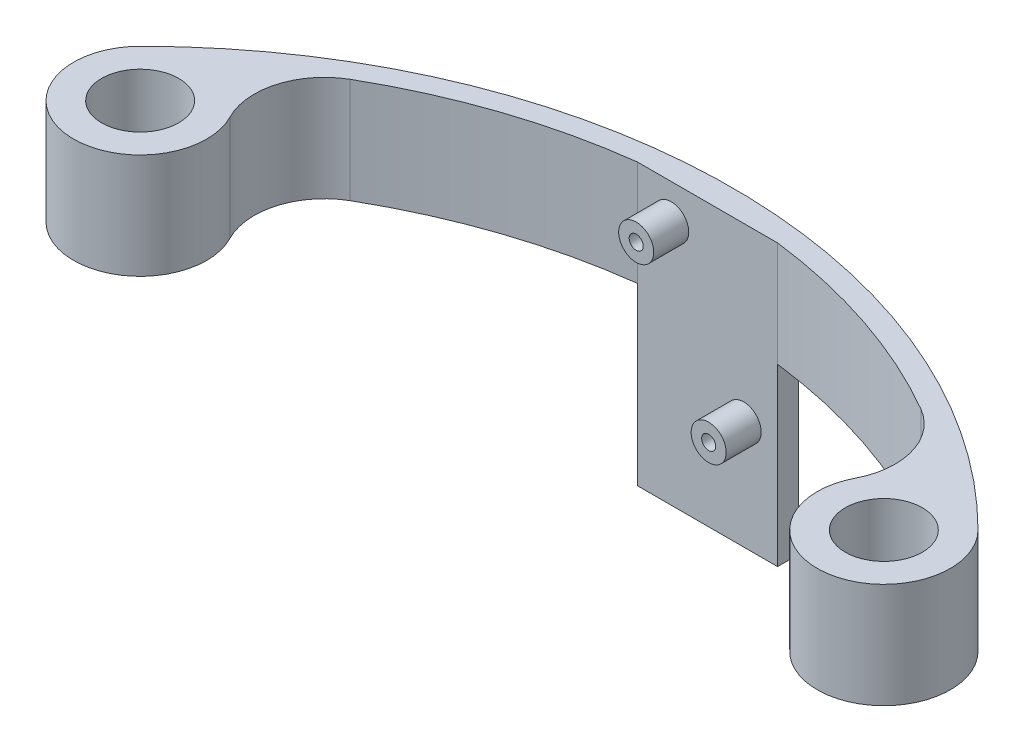
ISO-10303-21;
HEADER;
FILE_DESCRIPTION(('STEP AP214'),'2;1');
FILE_NAME('part.step','',(''),(''),'','','');
FILE_SCHEMA(('AUTOMOTIVE_DESIGN { 1 0 10303 214 1 1 1 1 }'));
ENDSEC;
DATA;
#1=APPLICATION_CONTEXT('core data for automotive mechanical design processes');
#2=APPLICATION_PROTOCOL_DEFINITION('international standard','automotive_design',2000,#1);
#3=PRODUCT_CONTEXT('',#1,'mechanical');
#4=PRODUCT('Part','Part','',(#3));
#5=PRODUCT_RELATED_PRODUCT_CATEGORY('part','',(#4));
#6=PRODUCT_DEFINITION_FORMATION('','',#4);
#7=PRODUCT_DEFINITION_CONTEXT('part definition',#1,'design');
#8=PRODUCT_DEFINITION('design','',#6,#7);
#9=PRODUCT_DEFINITION_SHAPE('','',#8);
#10=(LENGTH_UNIT() NAMED_UNIT(*) SI_UNIT(.MILLI.,.METRE.));
#11=(NAMED_UNIT(*) PLANE_ANGLE_UNIT() SI_UNIT($,.RADIAN.));
#12=(NAMED_UNIT(*) SI_UNIT($,.STERADIAN.) SOLID_ANGLE_UNIT());
#13=UNCERTAINTY_MEASURE_WITH_UNIT(LENGTH_MEASURE(1.E-05),#10,'distance_accuracy_value','');
#14=(GEOMETRIC_REPRESENTATION_CONTEXT(3) GLOBAL_UNCERTAINTY_ASSIGNED_CONTEXT((#13)) GLOBAL_UNIT_ASSIGNED_CONTEXT((#10,
#11,#12)) REPRESENTATION_CONTEXT('',''));
#15=CARTESIAN_POINT('',(0.,0.,0.));
#16=DIRECTION('',(0.,0.,1.));
#17=DIRECTION('',(1.,0.,0.));
#18=AXIS2_PLACEMENT_3D('',#15,#16,#17);
#19=CARTESIAN_POINT('',(0.,0.,0.));
#20=DIRECTION('',(0.,0.,1.));
#21=DIRECTION('',(1.,0.,0.));
#22=AXIS2_PLACEMENT_3D('',#19,#20,#21);
#23=PLANE('',#22);
#24=DIRECTION('',(-1.,0.,0.));
#25=VECTOR('',#24,1.);
#26=CARTESIAN_POINT('',(0.,-15.,0.));
#27=LINE('',#26,#25);
#28=CARTESIAN_POINT('',(20.,-15.,0.));
#29=VERTEX_POINT('',#28);
#30=CARTESIAN_POINT('',(0.,-15.,0.));
#31=VERTEX_POINT('',#30);
#32=EDGE_CURVE('E168',#29,#31,#27,.T.);
#33=ORIENTED_EDGE('',*,*,#32,.F.);
#34=DIRECTION('',(0.,-1.,0.));
#35=VECTOR('',#34,1.);
#36=CARTESIAN_POINT('',(20.,0.,0.));
#37=LINE('',#36,#35);
#38=CARTESIAN_POINT('',(20.,-40.,0.));
#39=VERTEX_POINT('',#38);
#40=EDGE_CURVE('E156',#29,#39,#37,.T.);
#41=ORIENTED_EDGE('',*,*,#40,.T.);
#42=DIRECTION('',(1.,0.,0.));
#43=VECTOR('',#42,1.);
#44=CARTESIAN_POINT('',(0.,-40.,0.));
#45=LINE('',#44,#43);
#46=CARTESIAN_POINT('',(0.,-40.,0.));
#47=VERTEX_POINT('',#46);
#48=EDGE_CURVE('E301',#47,#39,#45,.T.);
#49=ORIENTED_EDGE('',*,*,#48,.F.);
#50=DIRECTION('',(0.,-1.,0.));
#51=VECTOR('',#50,1.);
#52=CARTESIAN_POINT('',(0.,0.,0.));
#53=LINE('',#52,#51);
#54=EDGE_CURVE('E164',#31,#47,#53,.T.);
#55=ORIENTED_EDGE('',*,*,#54,.F.);
#56=EDGE_LOOP('',(#33,#41,#49,#55));
#57=FACE_BOUND('',#56,.T.);
#58=ADVANCED_FACE('F47',(#57),#23,.F.);
#59=CARTESIAN_POINT('',(0.,0.,3.));
#60=DIRECTION('',(1.,0.,0.));
#61=DIRECTION('',(0.,1.,0.));
#62=AXIS2_PLACEMENT_3D('',#59,#60,#61);
#63=PLANE('',#62);
#64=DIRECTION('',(0.,0.,1.));
#65=VECTOR('',#64,1.);
#66=CARTESIAN_POINT('',(0.,-15.,0.));
#67=LINE('',#66,#65);
#68=CARTESIAN_POINT('',(0.,-15.,3.));
#69=VERTEX_POINT('',#68);
#70=EDGE_CURVE('E71',#31,#69,#67,.T.);
#71=ORIENTED_EDGE('',*,*,#70,.F.);
#72=ORIENTED_EDGE('',*,*,#54,.T.);
#73=DIRECTION('',(0.,0.,-1.));
#74=VECTOR('',#73,1.);
#75=CARTESIAN_POINT('',(0.,-40.,3.));
#76=LINE('',#75,#74);
#77=CARTESIAN_POINT('',(0.,-40.,3.));
#78=VERTEX_POINT('',#77);
#79=EDGE_CURVE('E306',#78,#47,#76,.T.);
#80=ORIENTED_EDGE('',*,*,#79,.F.);
#81=DIRECTION('',(0.,-1.,0.));
#82=VECTOR('',#81,1.);
#83=CARTESIAN_POINT('',(0.,0.,3.));
#84=LINE('',#83,#82);
#85=EDGE_CURVE('E291',#69,#78,#84,.T.);
#86=ORIENTED_EDGE('',*,*,#85,.F.);
#87=EDGE_LOOP('',(#71,#72,#80,#86));
#88=FACE_BOUND('',#87,.T.);
#89=ADVANCED_FACE('F342',(#88),#63,.F.);
#90=CARTESIAN_POINT('',(20.,0.,3.));
#91=DIRECTION('',(1.,0.,0.));
#92=DIRECTION('',(0.,1.,0.));
#93=AXIS2_PLACEMENT_3D('',#90,#91,#92);
#94=PLANE('',#93);
#95=DIRECTION('',(0.,0.,-1.));
#96=VECTOR('',#95,1.);
#97=CARTESIAN_POINT('',(20.,-15.,0.));
#98=LINE('',#97,#96);
#99=CARTESIAN_POINT('',(20.,-15.,3.));
#100=VERTEX_POINT('',#99);
#101=EDGE_CURVE('E63',#100,#29,#98,.T.);
#102=ORIENTED_EDGE('',*,*,#101,.F.);
#103=DIRECTION('',(0.,-1.,0.));
#104=VECTOR('',#103,1.);
#105=CARTESIAN_POINT('',(20.,0.,3.));
#106=LINE('',#105,#104);
#107=CARTESIAN_POINT('',(20.,-40.,3.));
#108=VERTEX_POINT('',#107);
#109=EDGE_CURVE('E287',#100,#108,#106,.T.);
#110=ORIENTED_EDGE('',*,*,#109,.T.);
#111=DIRECTION('',(0.,0.,-1.));
#112=VECTOR('',#111,1.);
#113=CARTESIAN_POINT('',(20.,-40.,3.));
#114=LINE('',#113,#112);
#115=EDGE_CURVE('E159',#108,#39,#114,.T.);
#116=ORIENTED_EDGE('',*,*,#115,.T.);
#117=ORIENTED_EDGE('',*,*,#40,.F.);
#118=EDGE_LOOP('',(#102,#110,#116,#117));
#119=FACE_BOUND('',#118,.T.);
#120=ADVANCED_FACE('F49',(#119),#94,.T.);
#121=CARTESIAN_POINT('',(0.,0.,3.));
#122=DIRECTION('',(0.,1.,0.));
#123=DIRECTION('',(0.,0.,1.));
#124=AXIS2_PLACEMENT_3D('',#121,#122,#123);
#125=PLANE('',#124);
#126=CARTESIAN_POINT('',(63.05,0.,30.8901858933761));
#127=DIRECTION('',(0.,1.,0.));
#128=DIRECTION('',(0.,0.,1.));
#129=AXIS2_PLACEMENT_3D('',#126,#127,#128);
#130=CIRCLE('',#129,9.50000000000001);
#131=CARTESIAN_POINT('',(54.6086294125521,0.,26.5320598505258));
#132=VERTEX_POINT('',#131);
#133=CARTESIAN_POINT('',(69.7696666666667,0.,24.174824407284));
#134=VERTEX_POINT('',#133);
#135=EDGE_CURVE('E182',#132,#134,#130,.T.);
#136=ORIENTED_EDGE('',*,*,#135,.T.);
#137=CARTESIAN_POINT('',(10.,0.,83.906197625682));
#138=DIRECTION('',(0.,1.,0.));
#139=DIRECTION('',(0.,0.,1.));
#140=AXIS2_PLACEMENT_3D('',#137,#138,#139);
#141=CIRCLE('',#140,84.5);
#142=CARTESIAN_POINT('',(-49.7696666666667,0.,24.1748244072839));
#143=VERTEX_POINT('',#142);
#144=EDGE_CURVE('E240',#134,#143,#141,.T.);
#145=ORIENTED_EDGE('',*,*,#144,.T.);
#146=CARTESIAN_POINT('',(-43.05,0.,30.8901858933761));
#147=DIRECTION('',(0.,1.,0.));
#148=DIRECTION('',(0.,0.,1.));
#149=AXIS2_PLACEMENT_3D('',#146,#147,#148);
#150=CIRCLE('',#149,9.50000000000004);
#151=CARTESIAN_POINT('',(-34.6086294125521,0.,26.5320598505257));
#152=VERTEX_POINT('',#151);
#153=EDGE_CURVE('E244',#143,#152,#150,.T.);
#154=ORIENTED_EDGE('',*,*,#153,.T.);
#155=CARTESIAN_POINT('',(-25.722976162607,0.,21.9445587527886));
#156=DIRECTION('',(0.,1.,0.));
#157=DIRECTION('',(0.,0.,1.));
#158=AXIS2_PLACEMENT_3D('',#155,#156,#157);
#159=CIRCLE('',#158,10.);
#160=CARTESIAN_POINT('',(-30.7176699173471,0.,13.2812433195171));
#161=VERTEX_POINT('',#160);
#162=EDGE_CURVE('E207',#161,#152,#159,.T.);
#163=ORIENTED_EDGE('',*,*,#162,.F.);
#164=CARTESIAN_POINT('',(10.,0.,83.906197625682));
#165=DIRECTION('',(0.,1.,0.));
#166=DIRECTION('',(0.,0.,1.));
#167=AXIS2_PLACEMENT_3D('',#164,#165,#166);
#168=CIRCLE('',#167,81.5218548258436);
#169=CARTESIAN_POINT('',(0.,0.,3.));
#170=VERTEX_POINT('',#169);
#171=EDGE_CURVE('E237',#170,#161,#168,.T.);
#172=ORIENTED_EDGE('',*,*,#171,.F.);
#173=DIRECTION('',(1.,0.,0.));
#174=VECTOR('',#173,1.);
#175=CARTESIAN_POINT('',(0.,0.,3.));
#176=LINE('',#175,#174);
#177=CARTESIAN_POINT('',(20.,0.,3.));
#178=VERTEX_POINT('',#177);
#179=EDGE_CURVE('E286',#170,#178,#176,.T.);
#180=ORIENTED_EDGE('',*,*,#179,.T.);
#181=CARTESIAN_POINT('',(10.,0.,83.906197625682));
#182=DIRECTION('',(0.,1.,0.));
#183=DIRECTION('',(0.,0.,1.));
#184=AXIS2_PLACEMENT_3D('',#181,#182,#183);
#185=CIRCLE('',#184,81.5218548258436);
#186=CARTESIAN_POINT('',(50.7176699173472,0.,13.2812433195171));
#187=VERTEX_POINT('',#186);
#188=EDGE_CURVE('E194',#187,#178,#185,.T.);
#189=ORIENTED_EDGE('',*,*,#188,.F.);
#190=CARTESIAN_POINT('',(45.722976162607,0.,21.9445587527886));
#191=DIRECTION('',(0.,1.,0.));
#192=DIRECTION('',(0.,0.,1.));
#193=AXIS2_PLACEMENT_3D('',#190,#191,#192);
#194=CIRCLE('',#193,10.);
#195=EDGE_CURVE('E198',#187,#132,#194,.F.);
#196=ORIENTED_EDGE('',*,*,#195,.T.);
#197=EDGE_LOOP('',(#136,#145,#154,#163,#172,#180,#189,#196));
#198=FACE_BOUND('',#197,.T.);
#199=CARTESIAN_POINT('',(-43.05,0.,30.8901858933761));
#200=DIRECTION('',(0.,1.,0.));
#201=DIRECTION('',(0.,0.,1.));
#202=AXIS2_PLACEMENT_3D('',#199,#200,#201);
#203=CIRCLE('',#202,5.5);
#204=CARTESIAN_POINT('',(-43.05,0.,36.3901858933761));
#205=VERTEX_POINT('',#204);
#206=EDGE_CURVE('E217',#205,#205,#203,.T.);
#207=ORIENTED_EDGE('',*,*,#206,.F.);
#208=EDGE_LOOP('',(#207));
#209=FACE_BOUND('',#208,.T.);
#210=CARTESIAN_POINT('',(63.05,0.,30.8901858933761));
#211=DIRECTION('',(0.,1.,0.));
#212=DIRECTION('',(0.,0.,1.));
#213=AXIS2_PLACEMENT_3D('',#210,#211,#212);
#214=CIRCLE('',#213,5.5);
#215=CARTESIAN_POINT('',(63.05,0.,36.3901858933761));
#216=VERTEX_POINT('',#215);
#217=EDGE_CURVE('E172',#216,#216,#214,.T.);
#218=ORIENTED_EDGE('',*,*,#217,.F.);
#219=EDGE_LOOP('',(#218));
#220=FACE_BOUND('',#219,.T.);
#221=ADVANCED_FACE('F349',(#198,#209,#220),#125,.T.);
#222=CARTESIAN_POINT('',(0.,-40.,3.));
#223=DIRECTION('',(0.,1.,0.));
#224=DIRECTION('',(0.,0.,1.));
#225=AXIS2_PLACEMENT_3D('',#222,#223,#224);
#226=PLANE('',#225);
#227=ORIENTED_EDGE('',*,*,#48,.T.);
#228=ORIENTED_EDGE('',*,*,#115,.F.);
#229=DIRECTION('',(1.,0.,0.));
#230=VECTOR('',#229,1.);
#231=CARTESIAN_POINT('',(0.,-40.,3.));
#232=LINE('',#231,#230);
#233=EDGE_CURVE('E295',#78,#108,#232,.T.);
#234=ORIENTED_EDGE('',*,*,#233,.F.);
#235=ORIENTED_EDGE('',*,*,#79,.T.);
#236=EDGE_LOOP('',(#227,#228,#234,#235));
#237=FACE_BOUND('',#236,.T.);
#238=ADVANCED_FACE('F335',(#237),#226,.F.);
#239=CARTESIAN_POINT('',(0.,0.,3.));
#240=DIRECTION('',(0.,0.,1.));
#241=DIRECTION('',(1.,0.,0.));
#242=AXIS2_PLACEMENT_3D('',#239,#240,#241);
#243=PLANE('',#242);
#244=CARTESIAN_POINT('',(15.1678,-24.558,3.));
#245=DIRECTION('',(0.,0.,1.));
#246=DIRECTION('',(1.,0.,0.));
#247=AXIS2_PLACEMENT_3D('',#244,#245,#246);
#248=CIRCLE('',#247,2.5);
#249=CARTESIAN_POINT('',(17.6678,-24.558,3.));
#250=VERTEX_POINT('',#249);
#251=EDGE_CURVE('E254',#250,#250,#248,.T.);
#252=ORIENTED_EDGE('',*,*,#251,.F.);
#253=EDGE_LOOP('',(#252));
#254=FACE_BOUND('',#253,.T.);
#255=CARTESIAN_POINT('',(4.83,-5.,3.));
#256=DIRECTION('',(0.,0.,1.));
#257=DIRECTION('',(1.,0.,0.));
#258=AXIS2_PLACEMENT_3D('',#255,#256,#257);
#259=CIRCLE('',#258,2.5);
#260=CARTESIAN_POINT('',(7.33,-5.,3.));
#261=VERTEX_POINT('',#260);
#262=EDGE_CURVE('E269',#261,#261,#259,.T.);
#263=ORIENTED_EDGE('',*,*,#262,.F.);
#264=EDGE_LOOP('',(#263));
#265=FACE_BOUND('',#264,.T.);
#266=EDGE_CURVE('E283',#178,#100,#106,.T.);
#267=ORIENTED_EDGE('',*,*,#266,.F.);
#268=ORIENTED_EDGE('',*,*,#179,.F.);
#269=EDGE_CURVE('E292',#170,#69,#84,.T.);
#270=ORIENTED_EDGE('',*,*,#269,.T.);
#271=ORIENTED_EDGE('',*,*,#85,.T.);
#272=ORIENTED_EDGE('',*,*,#233,.T.);
#273=ORIENTED_EDGE('',*,*,#109,.F.);
#274=EDGE_LOOP('',(#267,#268,#270,#271,#272,#273));
#275=FACE_BOUND('',#274,.T.);
#276=ADVANCED_FACE('F320',(#254,#265,#275),#243,.T.);
#277=CARTESIAN_POINT('',(4.83,-5.,8.));
#278=DIRECTION('',(0.,0.,-1.));
#279=DIRECTION('',(-1.,0.,0.));
#280=AXIS2_PLACEMENT_3D('',#277,#278,#279);
#281=CYLINDRICAL_SURFACE('',#280,1.);
#282=CARTESIAN_POINT('',(4.83,-5.,8.));
#283=DIRECTION('',(0.,0.,1.));
#284=DIRECTION('',(1.,0.,0.));
#285=AXIS2_PLACEMENT_3D('',#282,#283,#284);
#286=CIRCLE('',#285,1.);
#287=CARTESIAN_POINT('',(5.83,-5.,8.));
#288=VERTEX_POINT('',#287);
#289=EDGE_CURVE('E273',#288,#288,#286,.T.);
#290=ORIENTED_EDGE('',*,*,#289,.T.);
#291=EDGE_LOOP('',(#290));
#292=FACE_BOUND('',#291,.T.);
#293=CARTESIAN_POINT('',(4.83,-5.,3.));
#294=DIRECTION('',(0.,0.,1.));
#295=DIRECTION('',(1.,0.,0.));
#296=AXIS2_PLACEMENT_3D('',#293,#294,#295);
#297=CIRCLE('',#296,1.);
#298=CARTESIAN_POINT('',(5.83,-5.,3.));
#299=VERTEX_POINT('',#298);
#300=EDGE_CURVE('E56',#299,#299,#297,.F.);
#301=ORIENTED_EDGE('',*,*,#300,.T.);
#302=EDGE_LOOP('',(#301));
#303=FACE_BOUND('',#302,.T.);
#304=ADVANCED_FACE('F313',(#292,#303),#281,.F.);
#305=CARTESIAN_POINT('',(4.83,-5.,8.));
#306=DIRECTION('',(0.,0.,-1.));
#307=DIRECTION('',(-1.,0.,0.));
#308=AXIS2_PLACEMENT_3D('',#305,#306,#307);
#309=CYLINDRICAL_SURFACE('',#308,2.5);
#310=CARTESIAN_POINT('',(4.83,-5.,8.));
#311=DIRECTION('',(0.,0.,1.));
#312=DIRECTION('',(1.,0.,0.));
#313=AXIS2_PLACEMENT_3D('',#310,#311,#312);
#314=CIRCLE('',#313,2.5);
#315=CARTESIAN_POINT('',(7.33,-5.,8.));
#316=VERTEX_POINT('',#315);
#317=EDGE_CURVE('E165',#316,#316,#314,.T.);
#318=ORIENTED_EDGE('',*,*,#317,.F.);
#319=EDGE_LOOP('',(#318));
#320=FACE_BOUND('',#319,.T.);
#321=ORIENTED_EDGE('',*,*,#262,.T.);
#322=EDGE_LOOP('',(#321));
#323=FACE_BOUND('',#322,.T.);
#324=ADVANCED_FACE('F329',(#320,#323),#309,.T.);
#325=CARTESIAN_POINT('',(0.,0.,8.));
#326=DIRECTION('',(0.,0.,1.));
#327=DIRECTION('',(1.,0.,0.));
#328=AXIS2_PLACEMENT_3D('',#325,#326,#327);
#329=PLANE('',#328);
#330=ORIENTED_EDGE('',*,*,#289,.F.);
#331=EDGE_LOOP('',(#330));
#332=FACE_BOUND('',#331,.T.);
#333=ORIENTED_EDGE('',*,*,#317,.T.);
#334=EDGE_LOOP('',(#333));
#335=FACE_BOUND('',#334,.T.);
#336=ADVANCED_FACE('F318',(#332,#335),#329,.T.);
#337=ORIENTED_EDGE('',*,*,#300,.F.);
#338=EDGE_LOOP('',(#337));
#339=FACE_BOUND('',#338,.T.);
#340=ADVANCED_FACE('F315',(#339),#243,.T.);
#341=CARTESIAN_POINT('',(15.1678,-24.558,8.));
#342=DIRECTION('',(0.,0.,-1.));
#343=DIRECTION('',(-1.,0.,0.));
#344=AXIS2_PLACEMENT_3D('',#341,#342,#343);
#345=CYLINDRICAL_SURFACE('',#344,1.);
#346=CARTESIAN_POINT('',(15.1678,-24.558,8.));
#347=DIRECTION('',(0.,0.,1.));
#348=DIRECTION('',(1.,0.,0.));
#349=AXIS2_PLACEMENT_3D('',#346,#347,#348);
#350=CIRCLE('',#349,1.);
#351=CARTESIAN_POINT('',(16.1678,-24.558,8.));
#352=VERTEX_POINT('',#351);
#353=EDGE_CURVE('E261',#352,#352,#350,.T.);
#354=ORIENTED_EDGE('',*,*,#353,.T.);
#355=EDGE_LOOP('',(#354));
#356=FACE_BOUND('',#355,.T.);
#357=CARTESIAN_POINT('',(15.1678,-24.558,3.));
#358=DIRECTION('',(0.,0.,1.));
#359=DIRECTION('',(1.,0.,0.));
#360=AXIS2_PLACEMENT_3D('',#357,#358,#359);
#361=CIRCLE('',#360,1.);
#362=CARTESIAN_POINT('',(16.1678,-24.558,3.));
#363=VERTEX_POINT('',#362);
#364=EDGE_CURVE('E11',#363,#363,#361,.F.);
#365=ORIENTED_EDGE('',*,*,#364,.T.);
#366=EDGE_LOOP('',(#365));
#367=FACE_BOUND('',#366,.T.);
#368=ADVANCED_FACE('F317',(#356,#367),#345,.F.);
#369=CARTESIAN_POINT('',(15.1678,-24.558,8.));
#370=DIRECTION('',(0.,0.,-1.));
#371=DIRECTION('',(-1.,0.,0.));
#372=AXIS2_PLACEMENT_3D('',#369,#370,#371);
#373=CYLINDRICAL_SURFACE('',#372,2.5);
#374=CARTESIAN_POINT('',(15.1678,-24.558,8.));
#375=DIRECTION('',(0.,0.,1.));
#376=DIRECTION('',(1.,0.,0.));
#377=AXIS2_PLACEMENT_3D('',#374,#375,#376);
#378=CIRCLE('',#377,2.5);
#379=CARTESIAN_POINT('',(17.6678,-24.558,8.));
#380=VERTEX_POINT('',#379);
#381=EDGE_CURVE('E265',#380,#380,#378,.T.);
#382=ORIENTED_EDGE('',*,*,#381,.F.);
#383=EDGE_LOOP('',(#382));
#384=FACE_BOUND('',#383,.T.);
#385=ORIENTED_EDGE('',*,*,#251,.T.);
#386=EDGE_LOOP('',(#385));
#387=FACE_BOUND('',#386,.T.);
#388=ADVANCED_FACE('F326',(#384,#387),#373,.T.);
#389=CARTESIAN_POINT('',(0.,0.,8.));
#390=DIRECTION('',(0.,0.,1.));
#391=DIRECTION('',(1.,0.,0.));
#392=AXIS2_PLACEMENT_3D('',#389,#390,#391);
#393=PLANE('',#392);
#394=ORIENTED_EDGE('',*,*,#353,.F.);
#395=EDGE_LOOP('',(#394));
#396=FACE_BOUND('',#395,.T.);
#397=ORIENTED_EDGE('',*,*,#381,.T.);
#398=EDGE_LOOP('',(#397));
#399=FACE_BOUND('',#398,.T.);
#400=ADVANCED_FACE('F339',(#396,#399),#393,.T.);
#401=ORIENTED_EDGE('',*,*,#364,.F.);
#402=EDGE_LOOP('',(#401));
#403=FACE_BOUND('',#402,.T.);
#404=ADVANCED_FACE('F321',(#403),#243,.T.);
#405=CARTESIAN_POINT('',(-25.722976162607,-15.,21.9445587527886));
#406=DIRECTION('',(0.,1.,0.));
#407=DIRECTION('',(0.,0.,1.));
#408=AXIS2_PLACEMENT_3D('',#405,#406,#407);
#409=CYLINDRICAL_SURFACE('',#408,10.);
#410=ORIENTED_EDGE('',*,*,#162,.T.);
#411=DIRECTION('',(0.,1.,0.));
#412=VECTOR('',#411,1.);
#413=CARTESIAN_POINT('',(-34.6086294125521,-15.,26.5320598505257));
#414=LINE('',#413,#412);
#415=CARTESIAN_POINT('',(-34.6086294125521,-15.,26.5320598505257));
#416=VERTEX_POINT('',#415);
#417=EDGE_CURVE('E251',#416,#152,#414,.T.);
#418=ORIENTED_EDGE('',*,*,#417,.F.);
#419=CARTESIAN_POINT('',(-25.722976162607,-15.,21.9445587527886));
#420=DIRECTION('',(0.,1.,0.));
#421=DIRECTION('',(0.,0.,1.));
#422=AXIS2_PLACEMENT_3D('',#419,#420,#421);
#423=CIRCLE('',#422,10.);
#424=CARTESIAN_POINT('',(-30.7176699173471,-15.,13.2812433195171));
#425=VERTEX_POINT('',#424);
#426=EDGE_CURVE('E213',#425,#416,#423,.T.);
#427=ORIENTED_EDGE('',*,*,#426,.F.);
#428=DIRECTION('',(0.,1.,0.));
#429=VECTOR('',#428,1.);
#430=CARTESIAN_POINT('',(-30.7176699173471,-15.,13.2812433195171));
#431=LINE('',#430,#429);
#432=EDGE_CURVE('E233',#425,#161,#431,.T.);
#433=ORIENTED_EDGE('',*,*,#432,.T.);
#434=EDGE_LOOP('',(#410,#418,#427,#433));
#435=FACE_BOUND('',#434,.T.);
#436=ADVANCED_FACE('F338',(#435),#409,.F.);
#437=CARTESIAN_POINT('',(-43.05,-15.,30.8901858933761));
#438=DIRECTION('',(0.,1.,0.));
#439=DIRECTION('',(0.,0.,1.));
#440=AXIS2_PLACEMENT_3D('',#437,#438,#439);
#441=CYLINDRICAL_SURFACE('',#440,9.50000000000004);
#442=ORIENTED_EDGE('',*,*,#153,.F.);
#443=DIRECTION('',(0.,1.,0.));
#444=VECTOR('',#443,1.);
#445=CARTESIAN_POINT('',(-49.7696666666667,-15.,24.1748244072839));
#446=LINE('',#445,#444);
#447=CARTESIAN_POINT('',(-49.7696666666667,-15.,24.1748244072839));
#448=VERTEX_POINT('',#447);
#449=EDGE_CURVE('E255',#448,#143,#446,.T.);
#450=ORIENTED_EDGE('',*,*,#449,.F.);
#451=CARTESIAN_POINT('',(-43.05,-15.,30.8901858933761));
#452=DIRECTION('',(0.,1.,0.));
#453=DIRECTION('',(0.,0.,1.));
#454=AXIS2_PLACEMENT_3D('',#451,#452,#453);
#455=CIRCLE('',#454,9.50000000000004);
#456=EDGE_CURVE('E225',#448,#416,#455,.T.);
#457=ORIENTED_EDGE('',*,*,#456,.T.);
#458=ORIENTED_EDGE('',*,*,#417,.T.);
#459=EDGE_LOOP('',(#442,#450,#457,#458));
#460=FACE_BOUND('',#459,.T.);
#461=ADVANCED_FACE('F389',(#460),#441,.T.);
#462=CARTESIAN_POINT('',(10.,-15.,83.906197625682));
#463=DIRECTION('',(0.,1.,0.));
#464=DIRECTION('',(0.,0.,1.));
#465=AXIS2_PLACEMENT_3D('',#462,#463,#464);
#466=CYLINDRICAL_SURFACE('',#465,84.5);
#467=ORIENTED_EDGE('',*,*,#144,.F.);
#468=DIRECTION('',(0.,1.,0.));
#469=VECTOR('',#468,1.);
#470=CARTESIAN_POINT('',(69.7696666666667,-15.,24.174824407284));
#471=LINE('',#470,#469);
#472=CARTESIAN_POINT('',(69.7696666666667,-15.,24.174824407284));
#473=VERTEX_POINT('',#472);
#474=EDGE_CURVE('E139',#473,#134,#471,.T.);
#475=ORIENTED_EDGE('',*,*,#474,.F.);
#476=CARTESIAN_POINT('',(10.,-15.,83.906197625682));
#477=DIRECTION('',(0.,1.,0.));
#478=DIRECTION('',(0.,0.,1.));
#479=AXIS2_PLACEMENT_3D('',#476,#477,#478);
#480=CIRCLE('',#479,84.5);
#481=EDGE_CURVE('E133',#473,#29,#480,.T.);
#482=ORIENTED_EDGE('',*,*,#481,.T.);
#483=CARTESIAN_POINT('',(10.,-15.,83.906197625682));
#484=DIRECTION('',(0.,1.,0.));
#485=DIRECTION('',(0.,0.,1.));
#486=AXIS2_PLACEMENT_3D('',#483,#484,#485);
#487=CIRCLE('',#486,84.5);
#488=EDGE_CURVE('E137',#29,#31,#487,.T.);
#489=ORIENTED_EDGE('',*,*,#488,.T.);
#490=CARTESIAN_POINT('',(10.,-15.,83.906197625682));
#491=DIRECTION('',(0.,1.,0.));
#492=DIRECTION('',(0.,0.,1.));
#493=AXIS2_PLACEMENT_3D('',#490,#491,#492);
#494=CIRCLE('',#493,84.5);
#495=EDGE_CURVE('E222',#31,#448,#494,.T.);
#496=ORIENTED_EDGE('',*,*,#495,.T.);
#497=ORIENTED_EDGE('',*,*,#449,.T.);
#498=EDGE_LOOP('',(#467,#475,#482,#489,#496,#497));
#499=FACE_BOUND('',#498,.T.);
#500=ADVANCED_FACE('F134',(#499),#466,.T.);
#501=CARTESIAN_POINT('',(10.,-15.,83.906197625682));
#502=DIRECTION('',(0.,1.,0.));
#503=DIRECTION('',(0.,0.,1.));
#504=AXIS2_PLACEMENT_3D('',#501,#502,#503);
#505=CYLINDRICAL_SURFACE('',#504,81.5218548258436);
#506=ORIENTED_EDGE('',*,*,#171,.T.);
#507=ORIENTED_EDGE('',*,*,#432,.F.);
#508=CARTESIAN_POINT('',(10.,-15.,83.906197625682));
#509=DIRECTION('',(0.,1.,0.));
#510=DIRECTION('',(0.,0.,1.));
#511=AXIS2_PLACEMENT_3D('',#508,#509,#510);
#512=CIRCLE('',#511,81.5218548258436);
#513=EDGE_CURVE('E216',#69,#425,#512,.T.);
#514=ORIENTED_EDGE('',*,*,#513,.F.);
#515=ORIENTED_EDGE('',*,*,#269,.F.);
#516=EDGE_LOOP('',(#506,#507,#514,#515));
#517=FACE_BOUND('',#516,.T.);
#518=ADVANCED_FACE('F387',(#517),#505,.F.);
#519=CARTESIAN_POINT('',(-43.05,-15.,30.8901858933761));
#520=DIRECTION('',(0.,1.,0.));
#521=DIRECTION('',(0.,0.,1.));
#522=AXIS2_PLACEMENT_3D('',#519,#520,#521);
#523=CYLINDRICAL_SURFACE('',#522,5.5);
#524=CARTESIAN_POINT('',(-43.05,-15.,30.8901858933761));
#525=DIRECTION('',(0.,1.,0.));
#526=DIRECTION('',(0.,0.,1.));
#527=AXIS2_PLACEMENT_3D('',#524,#525,#526);
#528=CIRCLE('',#527,5.5);
#529=CARTESIAN_POINT('',(-43.05,-15.,36.3901858933761));
#530=VERTEX_POINT('',#529);
#531=EDGE_CURVE('E229',#530,#530,#528,.T.);
#532=ORIENTED_EDGE('',*,*,#531,.F.);
#533=EDGE_LOOP('',(#532));
#534=FACE_BOUND('',#533,.T.);
#535=ORIENTED_EDGE('',*,*,#206,.T.);
#536=EDGE_LOOP('',(#535));
#537=FACE_BOUND('',#536,.T.);
#538=ADVANCED_FACE('F383',(#534,#537),#523,.F.);
#539=CARTESIAN_POINT('',(0.,-15.,0.));
#540=DIRECTION('',(0.,1.,0.));
#541=DIRECTION('',(0.,0.,1.));
#542=AXIS2_PLACEMENT_3D('',#539,#540,#541);
#543=PLANE('',#542);
#544=ORIENTED_EDGE('',*,*,#426,.T.);
#545=ORIENTED_EDGE('',*,*,#456,.F.);
#546=ORIENTED_EDGE('',*,*,#495,.F.);
#547=ORIENTED_EDGE('',*,*,#70,.T.);
#548=ORIENTED_EDGE('',*,*,#513,.T.);
#549=EDGE_LOOP('',(#544,#545,#546,#547,#548));
#550=FACE_BOUND('',#549,.T.);
#551=ORIENTED_EDGE('',*,*,#531,.T.);
#552=EDGE_LOOP('',(#551));
#553=FACE_BOUND('',#552,.T.);
#554=ADVANCED_FACE('F380',(#550,#553),#543,.F.);
#555=CARTESIAN_POINT('',(10.,-15.,83.906197625682));
#556=DIRECTION('',(0.,1.,0.));
#557=DIRECTION('',(0.,0.,1.));
#558=AXIS2_PLACEMENT_3D('',#555,#556,#557);
#559=CYLINDRICAL_SURFACE('',#558,81.5218548258436);
#560=ORIENTED_EDGE('',*,*,#188,.T.);
#561=ORIENTED_EDGE('',*,*,#266,.T.);
#562=CARTESIAN_POINT('',(10.,-15.,83.906197625682));
#563=DIRECTION('',(0.,1.,0.));
#564=DIRECTION('',(0.,0.,1.));
#565=AXIS2_PLACEMENT_3D('',#562,#563,#564);
#566=CIRCLE('',#565,81.5218548258436);
#567=CARTESIAN_POINT('',(50.7176699173472,-15.,13.2812433195171));
#568=VERTEX_POINT('',#567);
#569=EDGE_CURVE('E150',#568,#100,#566,.T.);
#570=ORIENTED_EDGE('',*,*,#569,.F.);
#571=DIRECTION('',(0.,1.,0.));
#572=VECTOR('',#571,1.);
#573=CARTESIAN_POINT('',(50.7176699173472,-15.,13.2812433195171));
#574=LINE('',#573,#572);
#575=EDGE_CURVE('E153',#568,#187,#574,.T.);
#576=ORIENTED_EDGE('',*,*,#575,.T.);
#577=EDGE_LOOP('',(#560,#561,#570,#576));
#578=FACE_BOUND('',#577,.T.);
#579=ADVANCED_FACE('F374',(#578),#559,.F.);
#580=CARTESIAN_POINT('',(63.05,-15.,30.8901858933761));
#581=DIRECTION('',(0.,1.,0.));
#582=DIRECTION('',(0.,0.,1.));
#583=AXIS2_PLACEMENT_3D('',#580,#581,#582);
#584=CYLINDRICAL_SURFACE('',#583,9.50000000000001);
#585=ORIENTED_EDGE('',*,*,#135,.F.);
#586=DIRECTION('',(0.,1.,0.));
#587=VECTOR('',#586,1.);
#588=CARTESIAN_POINT('',(54.6086294125521,-15.,26.5320598505258));
#589=LINE('',#588,#587);
#590=CARTESIAN_POINT('',(54.6086294125521,-15.,26.5320598505258));
#591=VERTEX_POINT('',#590);
#592=EDGE_CURVE('E208',#591,#132,#589,.T.);
#593=ORIENTED_EDGE('',*,*,#592,.F.);
#594=CARTESIAN_POINT('',(63.05,-15.,30.8901858933761));
#595=DIRECTION('',(0.,1.,0.));
#596=DIRECTION('',(0.,0.,1.));
#597=AXIS2_PLACEMENT_3D('',#594,#595,#596);
#598=CIRCLE('',#597,9.50000000000001);
#599=EDGE_CURVE('E144',#591,#473,#598,.T.);
#600=ORIENTED_EDGE('',*,*,#599,.T.);
#601=ORIENTED_EDGE('',*,*,#474,.T.);
#602=EDGE_LOOP('',(#585,#593,#600,#601));
#603=FACE_BOUND('',#602,.T.);
#604=ADVANCED_FACE('F365',(#603),#584,.T.);
#605=CARTESIAN_POINT('',(63.05,-15.,30.8901858933761));
#606=DIRECTION('',(0.,1.,0.));
#607=DIRECTION('',(0.,0.,1.));
#608=AXIS2_PLACEMENT_3D('',#605,#606,#607);
#609=CYLINDRICAL_SURFACE('',#608,5.5);
#610=CARTESIAN_POINT('',(63.05,-15.,30.8901858933761));
#611=DIRECTION('',(0.,1.,0.));
#612=DIRECTION('',(0.,0.,1.));
#613=AXIS2_PLACEMENT_3D('',#610,#611,#612);
#614=CIRCLE('',#613,5.5);
#615=CARTESIAN_POINT('',(63.05,-15.,36.3901858933761));
#616=VERTEX_POINT('',#615);
#617=EDGE_CURVE('E178',#616,#616,#614,.T.);
#618=ORIENTED_EDGE('',*,*,#617,.F.);
#619=EDGE_LOOP('',(#618));
#620=FACE_BOUND('',#619,.T.);
#621=ORIENTED_EDGE('',*,*,#217,.T.);
#622=EDGE_LOOP('',(#621));
#623=FACE_BOUND('',#622,.T.);
#624=ADVANCED_FACE('F362',(#620,#623),#609,.F.);
#625=CARTESIAN_POINT('',(45.722976162607,-15.,21.9445587527886));
#626=DIRECTION('',(0.,1.,0.));
#627=DIRECTION('',(0.,0.,1.));
#628=AXIS2_PLACEMENT_3D('',#625,#626,#627);
#629=CYLINDRICAL_SURFACE('',#628,10.);
#630=ORIENTED_EDGE('',*,*,#195,.F.);
#631=ORIENTED_EDGE('',*,*,#575,.F.);
#632=CARTESIAN_POINT('',(45.722976162607,-15.,21.9445587527886));
#633=DIRECTION('',(0.,1.,0.));
#634=DIRECTION('',(0.,0.,1.));
#635=AXIS2_PLACEMENT_3D('',#632,#633,#634);
#636=CIRCLE('',#635,10.);
#637=EDGE_CURVE('E185',#568,#591,#636,.F.);
#638=ORIENTED_EDGE('',*,*,#637,.T.);
#639=ORIENTED_EDGE('',*,*,#592,.T.);
#640=EDGE_LOOP('',(#630,#631,#638,#639));
#641=FACE_BOUND('',#640,.T.);
#642=ADVANCED_FACE('F364',(#641),#629,.F.);
#643=CARTESIAN_POINT('',(0.,-15.,0.));
#644=DIRECTION('',(0.,1.,0.));
#645=DIRECTION('',(0.,0.,1.));
#646=AXIS2_PLACEMENT_3D('',#643,#644,#645);
#647=PLANE('',#646);
#648=ORIENTED_EDGE('',*,*,#617,.T.);
#649=EDGE_LOOP('',(#648));
#650=FACE_BOUND('',#649,.T.);
#651=ORIENTED_EDGE('',*,*,#569,.T.);
#652=ORIENTED_EDGE('',*,*,#101,.T.);
#653=ORIENTED_EDGE('',*,*,#481,.F.);
#654=ORIENTED_EDGE('',*,*,#599,.F.);
#655=ORIENTED_EDGE('',*,*,#637,.F.);
#656=EDGE_LOOP('',(#651,#652,#653,#654,#655));
#657=FACE_BOUND('',#656,.T.);
#658=ADVANCED_FACE('F147',(#650,#657),#647,.F.);
#659=CARTESIAN_POINT('',(0.,-15.,0.));
#660=DIRECTION('',(0.,1.,0.));
#661=DIRECTION('',(0.,0.,1.));
#662=AXIS2_PLACEMENT_3D('',#659,#660,#661);
#663=PLANE('',#662);
#664=ORIENTED_EDGE('',*,*,#32,.T.);
#665=ORIENTED_EDGE('',*,*,#488,.F.);
#666=EDGE_LOOP('',(#664,#665));
#667=FACE_BOUND('',#666,.T.);
#668=ADVANCED_FACE('F174',(#667),#663,.F.);
#669=CLOSED_SHELL('',(#58,#89,#120,#221,#238,#276,#304,#324,#336,#340,#368,#388,#400,#404,#436,
#461,#500,#518,#538,#554,#579,#604,#624,#642,#658,#668));
#670=MANIFOLD_SOLID_BREP('B2',#669);
#671=ADVANCED_BREP_SHAPE_REPRESENTATION('',(#18,#670),#14);
#672=SHAPE_DEFINITION_REPRESENTATION(#9,#671);
ENDSEC;
END-ISO-10303-21;
